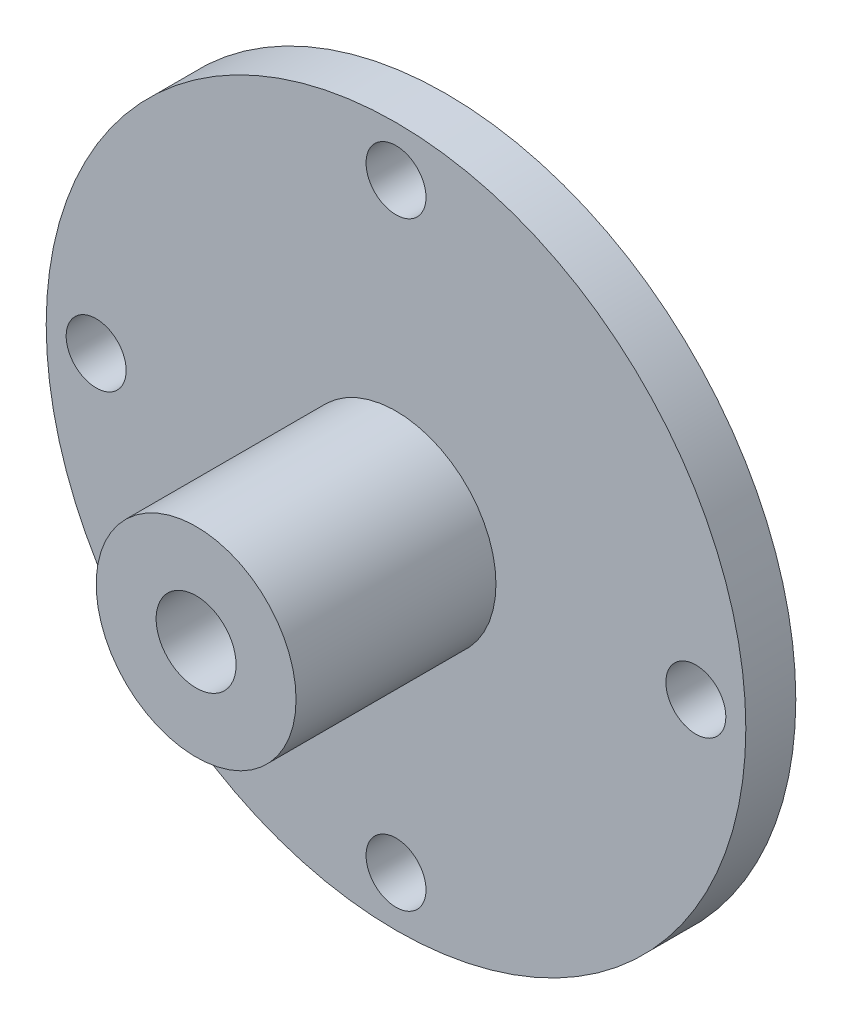
ISO-10303-21;
HEADER;
FILE_DESCRIPTION(('STEP AP214'),'2;1');
FILE_NAME('part.step','',(''),(''),'','','');
FILE_SCHEMA(('AUTOMOTIVE_DESIGN { 1 0 10303 214 1 1 1 1 }'));
ENDSEC;
DATA;
#1=APPLICATION_CONTEXT('core data for automotive mechanical design processes');
#2=APPLICATION_PROTOCOL_DEFINITION('international standard','automotive_design',2000,#1);
#3=PRODUCT_CONTEXT('',#1,'mechanical');
#4=PRODUCT('Part','Part','',(#3));
#5=PRODUCT_RELATED_PRODUCT_CATEGORY('part','',(#4));
#6=PRODUCT_DEFINITION_FORMATION('','',#4);
#7=PRODUCT_DEFINITION_CONTEXT('part definition',#1,'design');
#8=PRODUCT_DEFINITION('design','',#6,#7);
#9=PRODUCT_DEFINITION_SHAPE('','',#8);
#10=(LENGTH_UNIT() NAMED_UNIT(*) SI_UNIT(.MILLI.,.METRE.));
#11=(NAMED_UNIT(*) PLANE_ANGLE_UNIT() SI_UNIT($,.RADIAN.));
#12=(NAMED_UNIT(*) SI_UNIT($,.STERADIAN.) SOLID_ANGLE_UNIT());
#13=UNCERTAINTY_MEASURE_WITH_UNIT(LENGTH_MEASURE(1.E-05),#10,'distance_accuracy_value','');
#14=(GEOMETRIC_REPRESENTATION_CONTEXT(3) GLOBAL_UNCERTAINTY_ASSIGNED_CONTEXT((#13)) GLOBAL_UNIT_ASSIGNED_CONTEXT((#10,
#11,#12)) REPRESENTATION_CONTEXT('',''));
#15=CARTESIAN_POINT('',(0.,0.,0.));
#16=DIRECTION('',(0.,0.,1.));
#17=DIRECTION('',(1.,0.,0.));
#18=AXIS2_PLACEMENT_3D('',#15,#16,#17);
#19=CARTESIAN_POINT('',(0.,0.,5.));
#20=DIRECTION('',(0.,0.,-1.));
#21=DIRECTION('',(-1.,0.,0.));
#22=AXIS2_PLACEMENT_3D('',#19,#20,#21);
#23=CYLINDRICAL_SURFACE('',#22,35.);
#24=CARTESIAN_POINT('',(0.,0.,5.));
#25=DIRECTION('',(0.,0.,1.));
#26=DIRECTION('',(1.,0.,0.));
#27=AXIS2_PLACEMENT_3D('',#24,#25,#26);
#28=CIRCLE('',#27,35.);
#29=CARTESIAN_POINT('',(35.,0.,5.));
#30=VERTEX_POINT('',#29);
#31=EDGE_CURVE('E10',#30,#30,#28,.T.);
#32=ORIENTED_EDGE('',*,*,#31,.F.);
#33=EDGE_LOOP('',(#32));
#34=FACE_BOUND('',#33,.T.);
#35=CARTESIAN_POINT('',(0.,0.,0.));
#36=DIRECTION('',(0.,0.,1.));
#37=DIRECTION('',(1.,0.,0.));
#38=AXIS2_PLACEMENT_3D('',#35,#36,#37);
#39=CIRCLE('',#38,35.);
#40=CARTESIAN_POINT('',(35.,0.,0.));
#41=VERTEX_POINT('',#40);
#42=EDGE_CURVE('E35',#41,#41,#39,.T.);
#43=ORIENTED_EDGE('',*,*,#42,.T.);
#44=EDGE_LOOP('',(#43));
#45=FACE_BOUND('',#44,.T.);
#46=ADVANCED_FACE('F32',(#34,#45),#23,.T.);
#47=CARTESIAN_POINT('',(0.,0.,5.));
#48=DIRECTION('',(0.,0.,1.));
#49=DIRECTION('',(1.,0.,0.));
#50=AXIS2_PLACEMENT_3D('',#47,#48,#49);
#51=PLANE('',#50);
#52=CARTESIAN_POINT('',(0.,0.,5.));
#53=DIRECTION('',(0.,0.,1.));
#54=DIRECTION('',(1.,0.,0.));
#55=AXIS2_PLACEMENT_3D('',#52,#53,#54);
#56=CIRCLE('',#55,10.);
#57=CARTESIAN_POINT('',(10.,0.,5.));
#58=VERTEX_POINT('',#57);
#59=EDGE_CURVE('E68',#58,#58,#56,.T.);
#60=ORIENTED_EDGE('',*,*,#59,.F.);
#61=EDGE_LOOP('',(#60));
#62=FACE_BOUND('',#61,.T.);
#63=CARTESIAN_POINT('',(0.,30.,5.));
#64=DIRECTION('',(0.,0.,1.));
#65=DIRECTION('',(1.,0.,0.));
#66=AXIS2_PLACEMENT_3D('',#63,#64,#65);
#67=CIRCLE('',#66,3.);
#68=CARTESIAN_POINT('',(3.,30.,5.));
#69=VERTEX_POINT('',#68);
#70=EDGE_CURVE('E63',#69,#69,#67,.T.);
#71=ORIENTED_EDGE('',*,*,#70,.F.);
#72=EDGE_LOOP('',(#71));
#73=FACE_BOUND('',#72,.T.);
#74=CARTESIAN_POINT('',(30.0000000000008,8.48977342514678E-13,5.));
#75=DIRECTION('',(0.,0.,1.));
#76=DIRECTION('',(1.,0.,0.));
#77=AXIS2_PLACEMENT_3D('',#74,#75,#76);
#78=CIRCLE('',#77,3.00000000000066);
#79=CARTESIAN_POINT('',(33.0000000000015,8.48977342514678E-13,5.));
#80=VERTEX_POINT('',#79);
#81=EDGE_CURVE('E57',#80,#80,#78,.T.);
#82=ORIENTED_EDGE('',*,*,#81,.F.);
#83=EDGE_LOOP('',(#82));
#84=FACE_BOUND('',#83,.T.);
#85=CARTESIAN_POINT('',(1.69795468502936E-12,-30.,5.));
#86=DIRECTION('',(0.,0.,1.));
#87=DIRECTION('',(1.,0.,0.));
#88=AXIS2_PLACEMENT_3D('',#85,#86,#87);
#89=CIRCLE('',#88,3.00000000000182);
#90=CARTESIAN_POINT('',(3.00000000000352,-30.,5.));
#91=VERTEX_POINT('',#90);
#92=EDGE_CURVE('E51',#91,#91,#89,.T.);
#93=ORIENTED_EDGE('',*,*,#92,.F.);
#94=EDGE_LOOP('',(#93));
#95=FACE_BOUND('',#94,.T.);
#96=CARTESIAN_POINT('',(-29.9999999999992,-8.5265128291212E-13,5.));
#97=DIRECTION('',(0.,0.,1.));
#98=DIRECTION('',(1.,0.,0.));
#99=AXIS2_PLACEMENT_3D('',#96,#97,#98);
#100=CIRCLE('',#99,3.00000000000136);
#101=CARTESIAN_POINT('',(-26.9999999999978,-8.5265128291212E-13,5.));
#102=VERTEX_POINT('',#101);
#103=EDGE_CURVE('E44',#102,#102,#100,.T.);
#104=ORIENTED_EDGE('',*,*,#103,.F.);
#105=EDGE_LOOP('',(#104));
#106=FACE_BOUND('',#105,.T.);
#107=ORIENTED_EDGE('',*,*,#31,.T.);
#108=EDGE_LOOP('',(#107));
#109=FACE_BOUND('',#108,.T.);
#110=ADVANCED_FACE('F101',(#62,#73,#84,#95,#106,#109),#51,.T.);
#111=CARTESIAN_POINT('',(0.,0.,0.));
#112=DIRECTION('',(0.,0.,1.));
#113=DIRECTION('',(1.,0.,0.));
#114=AXIS2_PLACEMENT_3D('',#111,#112,#113);
#115=PLANE('',#114);
#116=CARTESIAN_POINT('',(0.,30.,0.));
#117=DIRECTION('',(0.,0.,1.));
#118=DIRECTION('',(1.,0.,0.));
#119=AXIS2_PLACEMENT_3D('',#116,#117,#118);
#120=CIRCLE('',#119,3.);
#121=CARTESIAN_POINT('',(3.,30.,0.));
#122=VERTEX_POINT('',#121);
#123=EDGE_CURVE('E42',#122,#122,#120,.T.);
#124=ORIENTED_EDGE('',*,*,#123,.T.);
#125=EDGE_LOOP('',(#124));
#126=FACE_BOUND('',#125,.T.);
#127=CARTESIAN_POINT('',(30.0000000000008,8.48977342514678E-13,0.));
#128=DIRECTION('',(0.,0.,1.));
#129=DIRECTION('',(1.,0.,0.));
#130=AXIS2_PLACEMENT_3D('',#127,#128,#129);
#131=CIRCLE('',#130,3.00000000000066);
#132=CARTESIAN_POINT('',(33.0000000000015,8.48977342514678E-13,0.));
#133=VERTEX_POINT('',#132);
#134=EDGE_CURVE('E60',#133,#133,#131,.T.);
#135=ORIENTED_EDGE('',*,*,#134,.T.);
#136=EDGE_LOOP('',(#135));
#137=FACE_BOUND('',#136,.T.);
#138=CARTESIAN_POINT('',(1.69795468502936E-12,-30.,0.));
#139=DIRECTION('',(0.,0.,1.));
#140=DIRECTION('',(1.,0.,0.));
#141=AXIS2_PLACEMENT_3D('',#138,#139,#140);
#142=CIRCLE('',#141,3.00000000000182);
#143=CARTESIAN_POINT('',(3.00000000000352,-30.,0.));
#144=VERTEX_POINT('',#143);
#145=EDGE_CURVE('E54',#144,#144,#142,.T.);
#146=ORIENTED_EDGE('',*,*,#145,.T.);
#147=EDGE_LOOP('',(#146));
#148=FACE_BOUND('',#147,.T.);
#149=CARTESIAN_POINT('',(-29.9999999999992,-8.5265128291212E-13,0.));
#150=DIRECTION('',(0.,0.,1.));
#151=DIRECTION('',(1.,0.,0.));
#152=AXIS2_PLACEMENT_3D('',#149,#150,#151);
#153=CIRCLE('',#152,3.00000000000136);
#154=CARTESIAN_POINT('',(-26.9999999999978,-8.5265128291212E-13,0.));
#155=VERTEX_POINT('',#154);
#156=EDGE_CURVE('E47',#155,#155,#153,.T.);
#157=ORIENTED_EDGE('',*,*,#156,.T.);
#158=EDGE_LOOP('',(#157));
#159=FACE_BOUND('',#158,.T.);
#160=ORIENTED_EDGE('',*,*,#42,.F.);
#161=EDGE_LOOP('',(#160));
#162=FACE_BOUND('',#161,.T.);
#163=ADVANCED_FACE('F104',(#126,#137,#148,#159,#162),#115,.F.);
#164=CARTESIAN_POINT('',(-29.9999999999992,-8.5265128291212E-13,0.));
#165=DIRECTION('',(0.,0.,1.));
#166=DIRECTION('',(1.,0.,0.));
#167=AXIS2_PLACEMENT_3D('',#164,#165,#166);
#168=CYLINDRICAL_SURFACE('',#167,3.00000000000136);
#169=ORIENTED_EDGE('',*,*,#156,.F.);
#170=EDGE_LOOP('',(#169));
#171=FACE_BOUND('',#170,.T.);
#172=ORIENTED_EDGE('',*,*,#103,.T.);
#173=EDGE_LOOP('',(#172));
#174=FACE_BOUND('',#173,.T.);
#175=ADVANCED_FACE('F114',(#171,#174),#168,.F.);
#176=CARTESIAN_POINT('',(1.69795468502936E-12,-30.,0.));
#177=DIRECTION('',(0.,0.,1.));
#178=DIRECTION('',(1.,0.,0.));
#179=AXIS2_PLACEMENT_3D('',#176,#177,#178);
#180=CYLINDRICAL_SURFACE('',#179,3.00000000000182);
#181=ORIENTED_EDGE('',*,*,#145,.F.);
#182=EDGE_LOOP('',(#181));
#183=FACE_BOUND('',#182,.T.);
#184=ORIENTED_EDGE('',*,*,#92,.T.);
#185=EDGE_LOOP('',(#184));
#186=FACE_BOUND('',#185,.T.);
#187=ADVANCED_FACE('F116',(#183,#186),#180,.F.);
#188=CARTESIAN_POINT('',(30.0000000000008,8.48977342514678E-13,0.));
#189=DIRECTION('',(0.,0.,1.));
#190=DIRECTION('',(1.,0.,0.));
#191=AXIS2_PLACEMENT_3D('',#188,#189,#190);
#192=CYLINDRICAL_SURFACE('',#191,3.00000000000066);
#193=ORIENTED_EDGE('',*,*,#134,.F.);
#194=EDGE_LOOP('',(#193));
#195=FACE_BOUND('',#194,.T.);
#196=ORIENTED_EDGE('',*,*,#81,.T.);
#197=EDGE_LOOP('',(#196));
#198=FACE_BOUND('',#197,.T.);
#199=ADVANCED_FACE('F123',(#195,#198),#192,.F.);
#200=CARTESIAN_POINT('',(0.,30.,0.));
#201=DIRECTION('',(0.,0.,1.));
#202=DIRECTION('',(1.,0.,0.));
#203=AXIS2_PLACEMENT_3D('',#200,#201,#202);
#204=CYLINDRICAL_SURFACE('',#203,3.);
#205=ORIENTED_EDGE('',*,*,#123,.F.);
#206=EDGE_LOOP('',(#205));
#207=FACE_BOUND('',#206,.T.);
#208=ORIENTED_EDGE('',*,*,#70,.T.);
#209=EDGE_LOOP('',(#208));
#210=FACE_BOUND('',#209,.T.);
#211=ADVANCED_FACE('F97',(#207,#210),#204,.F.);
#212=CARTESIAN_POINT('',(0.,0.,25.));
#213=DIRECTION('',(0.,0.,-1.));
#214=DIRECTION('',(-1.,0.,0.));
#215=AXIS2_PLACEMENT_3D('',#212,#213,#214);
#216=CYLINDRICAL_SURFACE('',#215,10.);
#217=CARTESIAN_POINT('',(0.,0.,25.));
#218=DIRECTION('',(0.,0.,1.));
#219=DIRECTION('',(1.,0.,0.));
#220=AXIS2_PLACEMENT_3D('',#217,#218,#219);
#221=CIRCLE('',#220,10.);
#222=CARTESIAN_POINT('',(10.,0.,25.));
#223=VERTEX_POINT('',#222);
#224=EDGE_CURVE('E48',#223,#223,#221,.T.);
#225=ORIENTED_EDGE('',*,*,#224,.F.);
#226=EDGE_LOOP('',(#225));
#227=FACE_BOUND('',#226,.T.);
#228=ORIENTED_EDGE('',*,*,#59,.T.);
#229=EDGE_LOOP('',(#228));
#230=FACE_BOUND('',#229,.T.);
#231=ADVANCED_FACE('F91',(#227,#230),#216,.T.);
#232=CARTESIAN_POINT('',(0.,0.,25.));
#233=DIRECTION('',(0.,0.,1.));
#234=DIRECTION('',(1.,0.,0.));
#235=AXIS2_PLACEMENT_3D('',#232,#233,#234);
#236=PLANE('',#235);
#237=CARTESIAN_POINT('',(0.,0.,25.));
#238=DIRECTION('',(0.,0.,1.));
#239=DIRECTION('',(1.,0.,0.));
#240=AXIS2_PLACEMENT_3D('',#237,#238,#239);
#241=CIRCLE('',#240,4.);
#242=CARTESIAN_POINT('',(4.,0.,25.));
#243=VERTEX_POINT('',#242);
#244=EDGE_CURVE('E74',#243,#243,#241,.T.);
#245=ORIENTED_EDGE('',*,*,#244,.F.);
#246=EDGE_LOOP('',(#245));
#247=FACE_BOUND('',#246,.T.);
#248=ORIENTED_EDGE('',*,*,#224,.T.);
#249=EDGE_LOOP('',(#248));
#250=FACE_BOUND('',#249,.T.);
#251=ADVANCED_FACE('F85',(#247,#250),#236,.T.);
#252=CARTESIAN_POINT('',(0.,0.,5.));
#253=DIRECTION('',(0.,0.,1.));
#254=DIRECTION('',(1.,0.,0.));
#255=AXIS2_PLACEMENT_3D('',#252,#253,#254);
#256=CYLINDRICAL_SURFACE('',#255,4.);
#257=CARTESIAN_POINT('',(0.,0.,5.));
#258=DIRECTION('',(0.,0.,1.));
#259=DIRECTION('',(1.,0.,0.));
#260=AXIS2_PLACEMENT_3D('',#257,#258,#259);
#261=CIRCLE('',#260,4.);
#262=CARTESIAN_POINT('',(4.,0.,5.));
#263=VERTEX_POINT('',#262);
#264=EDGE_CURVE('E71',#263,#263,#261,.T.);
#265=ORIENTED_EDGE('',*,*,#264,.F.);
#266=EDGE_LOOP('',(#265));
#267=FACE_BOUND('',#266,.T.);
#268=ORIENTED_EDGE('',*,*,#244,.T.);
#269=EDGE_LOOP('',(#268));
#270=FACE_BOUND('',#269,.T.);
#271=ADVANCED_FACE('F82',(#267,#270),#256,.F.);
#272=CARTESIAN_POINT('',(0.,0.,5.));
#273=DIRECTION('',(0.,0.,1.));
#274=DIRECTION('',(1.,0.,0.));
#275=AXIS2_PLACEMENT_3D('',#272,#273,#274);
#276=PLANE('',#275);
#277=ORIENTED_EDGE('',*,*,#264,.T.);
#278=EDGE_LOOP('',(#277));
#279=FACE_BOUND('',#278,.T.);
#280=ADVANCED_FACE('F80',(#279),#276,.T.);
#281=CLOSED_SHELL('',(#46,#110,#163,#175,#187,#199,#211,#231,#251,#271,#280));
#282=MANIFOLD_SOLID_BREP('B2',#281);
#283=ADVANCED_BREP_SHAPE_REPRESENTATION('',(#18,#282),#14);
#284=SHAPE_DEFINITION_REPRESENTATION(#9,#283);
ENDSEC;
END-ISO-10303-21;
